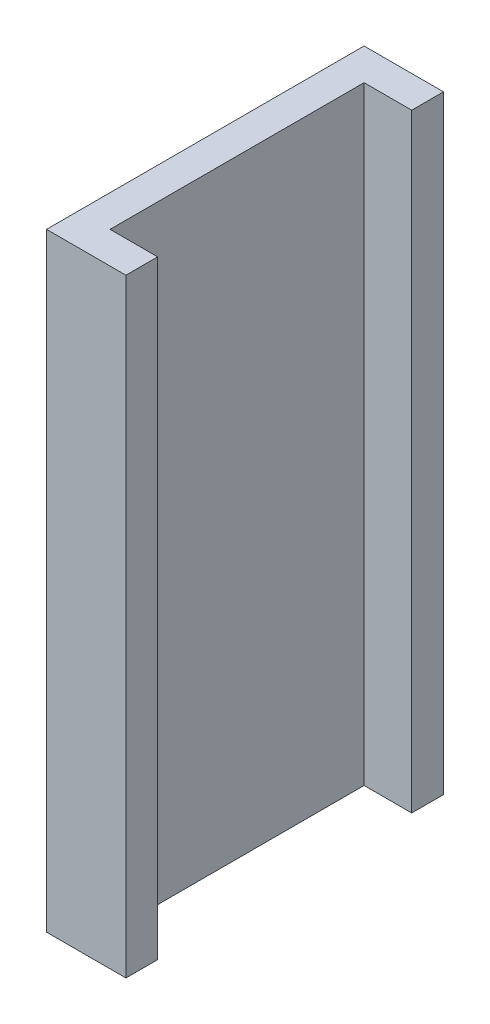
ISO-10303-21;
HEADER;
FILE_DESCRIPTION(('STEP AP214'),'2;1');
FILE_NAME('part.step','',(''),(''),'','','');
FILE_SCHEMA(('AUTOMOTIVE_DESIGN { 1 0 10303 214 1 1 1 1 }'));
ENDSEC;
DATA;
#1=APPLICATION_CONTEXT('core data for automotive mechanical design processes');
#2=APPLICATION_PROTOCOL_DEFINITION('international standard','automotive_design',2000,#1);
#3=PRODUCT_CONTEXT('',#1,'mechanical');
#4=PRODUCT('Part','Part','',(#3));
#5=PRODUCT_RELATED_PRODUCT_CATEGORY('part','',(#4));
#6=PRODUCT_DEFINITION_FORMATION('','',#4);
#7=PRODUCT_DEFINITION_CONTEXT('part definition',#1,'design');
#8=PRODUCT_DEFINITION('design','',#6,#7);
#9=PRODUCT_DEFINITION_SHAPE('','',#8);
#10=(LENGTH_UNIT() NAMED_UNIT(*) SI_UNIT(.MILLI.,.METRE.));
#11=(NAMED_UNIT(*) PLANE_ANGLE_UNIT() SI_UNIT($,.RADIAN.));
#12=(NAMED_UNIT(*) SI_UNIT($,.STERADIAN.) SOLID_ANGLE_UNIT());
#13=UNCERTAINTY_MEASURE_WITH_UNIT(LENGTH_MEASURE(1.E-05),#10,'distance_accuracy_value','');
#14=(GEOMETRIC_REPRESENTATION_CONTEXT(3) GLOBAL_UNCERTAINTY_ASSIGNED_CONTEXT((#13)) GLOBAL_UNIT_ASSIGNED_CONTEXT((#10,
#11,#12)) REPRESENTATION_CONTEXT('',''));
#15=CARTESIAN_POINT('',(0.,0.,0.));
#16=DIRECTION('',(0.,0.,1.));
#17=DIRECTION('',(1.,0.,0.));
#18=AXIS2_PLACEMENT_3D('',#15,#16,#17);
#19=CARTESIAN_POINT('',(0.15,0.,0.));
#20=DIRECTION('',(1.,0.,0.));
#21=DIRECTION('',(0.,0.,-1.));
#22=AXIS2_PLACEMENT_3D('',#19,#20,#21);
#23=PLANE('',#22);
#24=DIRECTION('',(0.,0.,1.));
#25=VECTOR('',#24,1.);
#26=CARTESIAN_POINT('',(0.15,1.15,0.));
#27=LINE('',#26,#25);
#28=CARTESIAN_POINT('',(0.15,1.15,0.06));
#29=VERTEX_POINT('',#28);
#30=CARTESIAN_POINT('',(0.15,1.15,0.));
#31=VERTEX_POINT('',#30);
#32=EDGE_CURVE('E100',#29,#31,#27,.F.);
#33=ORIENTED_EDGE('',*,*,#32,.F.);
#34=DIRECTION('',(0.,1.,0.));
#35=VECTOR('',#34,1.);
#36=CARTESIAN_POINT('',(0.15,0.,0.06));
#37=LINE('',#36,#35);
#38=CARTESIAN_POINT('',(0.15,0.,0.06));
#39=VERTEX_POINT('',#38);
#40=EDGE_CURVE('E99',#39,#29,#37,.T.);
#41=ORIENTED_EDGE('',*,*,#40,.F.);
#42=DIRECTION('',(0.,0.,1.));
#43=VECTOR('',#42,1.);
#44=CARTESIAN_POINT('',(0.15,0.,0.));
#45=LINE('',#44,#43);
#46=CARTESIAN_POINT('',(0.15,0.,0.));
#47=VERTEX_POINT('',#46);
#48=EDGE_CURVE('E84',#39,#47,#45,.F.);
#49=ORIENTED_EDGE('',*,*,#48,.T.);
#50=DIRECTION('',(0.,1.,0.));
#51=VECTOR('',#50,1.);
#52=CARTESIAN_POINT('',(0.15,0.,0.));
#53=LINE('',#52,#51);
#54=EDGE_CURVE('E110',#47,#31,#53,.T.);
#55=ORIENTED_EDGE('',*,*,#54,.T.);
#56=EDGE_LOOP('',(#33,#41,#49,#55));
#57=FACE_BOUND('',#56,.T.);
#58=ADVANCED_FACE('F17',(#57),#23,.T.);
#59=CARTESIAN_POINT('',(0.06,0.,0.54));
#60=DIRECTION('',(0.,0.,1.));
#61=DIRECTION('',(1.,0.,0.));
#62=AXIS2_PLACEMENT_3D('',#59,#60,#61);
#63=PLANE('',#62);
#64=DIRECTION('',(1.,0.,0.));
#65=VECTOR('',#64,1.);
#66=CARTESIAN_POINT('',(0.,0.,0.54));
#67=LINE('',#66,#65);
#68=CARTESIAN_POINT('',(0.15,0.,0.54));
#69=VERTEX_POINT('',#68);
#70=CARTESIAN_POINT('',(0.06,0.,0.54));
#71=VERTEX_POINT('',#70);
#72=EDGE_CURVE('E112',#69,#71,#67,.F.);
#73=ORIENTED_EDGE('',*,*,#72,.T.);
#74=DIRECTION('',(0.,1.,0.));
#75=VECTOR('',#74,1.);
#76=CARTESIAN_POINT('',(0.06,0.,0.54));
#77=LINE('',#76,#75);
#78=CARTESIAN_POINT('',(0.06,1.15,0.54));
#79=VERTEX_POINT('',#78);
#80=EDGE_CURVE('E20',#79,#71,#77,.F.);
#81=ORIENTED_EDGE('',*,*,#80,.F.);
#82=DIRECTION('',(1.,0.,0.));
#83=VECTOR('',#82,1.);
#84=CARTESIAN_POINT('',(0.,1.15,0.54));
#85=LINE('',#84,#83);
#86=CARTESIAN_POINT('',(0.15,1.15,0.54));
#87=VERTEX_POINT('',#86);
#88=EDGE_CURVE('E226',#87,#79,#85,.F.);
#89=ORIENTED_EDGE('',*,*,#88,.F.);
#90=DIRECTION('',(0.,1.,0.));
#91=VECTOR('',#90,1.);
#92=CARTESIAN_POINT('',(0.15,0.,0.54));
#93=LINE('',#92,#91);
#94=EDGE_CURVE('E78',#69,#87,#93,.T.);
#95=ORIENTED_EDGE('',*,*,#94,.F.);
#96=EDGE_LOOP('',(#73,#81,#89,#95));
#97=FACE_BOUND('',#96,.T.);
#98=ADVANCED_FACE('F124',(#97),#63,.F.);
#99=CARTESIAN_POINT('',(0.06,0.,0.06));
#100=DIRECTION('',(1.,0.,0.));
#101=DIRECTION('',(0.,0.,-1.));
#102=AXIS2_PLACEMENT_3D('',#99,#100,#101);
#103=PLANE('',#102);
#104=DIRECTION('',(0.,0.,1.));
#105=VECTOR('',#104,1.);
#106=CARTESIAN_POINT('',(0.06,1.15,0.));
#107=LINE('',#106,#105);
#108=CARTESIAN_POINT('',(0.06,1.15,0.06));
#109=VERTEX_POINT('',#108);
#110=EDGE_CURVE('E123',#79,#109,#107,.F.);
#111=ORIENTED_EDGE('',*,*,#110,.F.);
#112=ORIENTED_EDGE('',*,*,#80,.T.);
#113=DIRECTION('',(0.,0.,1.));
#114=VECTOR('',#113,1.);
#115=CARTESIAN_POINT('',(0.06,0.,0.));
#116=LINE('',#115,#114);
#117=CARTESIAN_POINT('',(0.06,0.,0.06));
#118=VERTEX_POINT('',#117);
#119=EDGE_CURVE('E108',#71,#118,#116,.F.);
#120=ORIENTED_EDGE('',*,*,#119,.T.);
#121=DIRECTION('',(0.,1.,0.));
#122=VECTOR('',#121,1.);
#123=CARTESIAN_POINT('',(0.06,0.,0.06));
#124=LINE('',#123,#122);
#125=EDGE_CURVE('E104',#109,#118,#124,.F.);
#126=ORIENTED_EDGE('',*,*,#125,.F.);
#127=EDGE_LOOP('',(#111,#112,#120,#126));
#128=FACE_BOUND('',#127,.T.);
#129=ADVANCED_FACE('F122',(#128),#103,.T.);
#130=CARTESIAN_POINT('',(0.06,0.,0.06));
#131=DIRECTION('',(0.,0.,1.));
#132=DIRECTION('',(1.,0.,0.));
#133=AXIS2_PLACEMENT_3D('',#130,#131,#132);
#134=PLANE('',#133);
#135=DIRECTION('',(1.,0.,0.));
#136=VECTOR('',#135,1.);
#137=CARTESIAN_POINT('',(0.,0.,0.06));
#138=LINE('',#137,#136);
#139=EDGE_CURVE('E89',#118,#39,#138,.T.);
#140=ORIENTED_EDGE('',*,*,#139,.T.);
#141=ORIENTED_EDGE('',*,*,#40,.T.);
#142=DIRECTION('',(1.,0.,0.));
#143=VECTOR('',#142,1.);
#144=CARTESIAN_POINT('',(0.,1.15,0.06));
#145=LINE('',#144,#143);
#146=EDGE_CURVE('E240',#109,#29,#145,.T.);
#147=ORIENTED_EDGE('',*,*,#146,.F.);
#148=ORIENTED_EDGE('',*,*,#125,.T.);
#149=EDGE_LOOP('',(#140,#141,#147,#148));
#150=FACE_BOUND('',#149,.T.);
#151=ADVANCED_FACE('F106',(#150),#134,.T.);
#152=CARTESIAN_POINT('',(0.15,0.,0.));
#153=DIRECTION('',(1.,0.,0.));
#154=DIRECTION('',(0.,0.,-1.));
#155=AXIS2_PLACEMENT_3D('',#152,#153,#154);
#156=PLANE('',#155);
#157=DIRECTION('',(0.,0.,1.));
#158=VECTOR('',#157,1.);
#159=CARTESIAN_POINT('',(0.15,1.15,0.));
#160=LINE('',#159,#158);
#161=CARTESIAN_POINT('',(0.15,1.15,0.6));
#162=VERTEX_POINT('',#161);
#163=EDGE_CURVE('E224',#162,#87,#160,.F.);
#164=ORIENTED_EDGE('',*,*,#163,.F.);
#165=DIRECTION('',(0.,1.,0.));
#166=VECTOR('',#165,1.);
#167=CARTESIAN_POINT('',(0.15,0.,0.6));
#168=LINE('',#167,#166);
#169=CARTESIAN_POINT('',(0.15,0.,0.6));
#170=VERTEX_POINT('',#169);
#171=EDGE_CURVE('E225',#170,#162,#168,.T.);
#172=ORIENTED_EDGE('',*,*,#171,.F.);
#173=DIRECTION('',(0.,0.,1.));
#174=VECTOR('',#173,1.);
#175=CARTESIAN_POINT('',(0.15,0.,0.));
#176=LINE('',#175,#174);
#177=EDGE_CURVE('E96',#170,#69,#176,.F.);
#178=ORIENTED_EDGE('',*,*,#177,.T.);
#179=ORIENTED_EDGE('',*,*,#94,.T.);
#180=EDGE_LOOP('',(#164,#172,#178,#179));
#181=FACE_BOUND('',#180,.T.);
#182=ADVANCED_FACE('F153',(#181),#156,.T.);
#183=CARTESIAN_POINT('',(0.,0.,0.));
#184=DIRECTION('',(0.,1.,0.));
#185=DIRECTION('',(0.,0.,1.));
#186=AXIS2_PLACEMENT_3D('',#183,#184,#185);
#187=PLANE('',#186);
#188=ORIENTED_EDGE('',*,*,#119,.F.);
#189=ORIENTED_EDGE('',*,*,#72,.F.);
#190=ORIENTED_EDGE('',*,*,#177,.F.);
#191=DIRECTION('',(1.,0.,0.));
#192=VECTOR('',#191,1.);
#193=CARTESIAN_POINT('',(0.,0.,0.6));
#194=LINE('',#193,#192);
#195=CARTESIAN_POINT('',(0.,0.,0.6));
#196=VERTEX_POINT('',#195);
#197=EDGE_CURVE('E234',#196,#170,#194,.T.);
#198=ORIENTED_EDGE('',*,*,#197,.F.);
#199=DIRECTION('',(0.,0.,-1.));
#200=VECTOR('',#199,1.);
#201=CARTESIAN_POINT('',(0.,0.,0.));
#202=LINE('',#201,#200);
#203=CARTESIAN_POINT('',(0.,0.,0.));
#204=VERTEX_POINT('',#203);
#205=EDGE_CURVE('E230',#196,#204,#202,.T.);
#206=ORIENTED_EDGE('',*,*,#205,.T.);
#207=DIRECTION('',(1.,0.,0.));
#208=VECTOR('',#207,1.);
#209=CARTESIAN_POINT('',(0.,0.,0.));
#210=LINE('',#209,#208);
#211=EDGE_CURVE('E92',#204,#47,#210,.T.);
#212=ORIENTED_EDGE('',*,*,#211,.T.);
#213=ORIENTED_EDGE('',*,*,#48,.F.);
#214=ORIENTED_EDGE('',*,*,#139,.F.);
#215=EDGE_LOOP('',(#188,#189,#190,#198,#206,#212,#213,#214));
#216=FACE_BOUND('',#215,.T.);
#217=ADVANCED_FACE('F87',(#216),#187,.F.);
#218=CARTESIAN_POINT('',(0.,0.,0.));
#219=DIRECTION('',(0.,0.,1.));
#220=DIRECTION('',(1.,0.,0.));
#221=AXIS2_PLACEMENT_3D('',#218,#219,#220);
#222=PLANE('',#221);
#223=ORIENTED_EDGE('',*,*,#54,.F.);
#224=ORIENTED_EDGE('',*,*,#211,.F.);
#225=DIRECTION('',(0.,1.,0.));
#226=VECTOR('',#225,1.);
#227=CARTESIAN_POINT('',(0.,0.,0.));
#228=LINE('',#227,#226);
#229=CARTESIAN_POINT('',(0.,1.15,0.));
#230=VERTEX_POINT('',#229);
#231=EDGE_CURVE('E232',#204,#230,#228,.T.);
#232=ORIENTED_EDGE('',*,*,#231,.T.);
#233=DIRECTION('',(1.,0.,0.));
#234=VECTOR('',#233,1.);
#235=CARTESIAN_POINT('',(0.,1.15,0.));
#236=LINE('',#235,#234);
#237=EDGE_CURVE('E227',#31,#230,#236,.F.);
#238=ORIENTED_EDGE('',*,*,#237,.F.);
#239=EDGE_LOOP('',(#223,#224,#232,#238));
#240=FACE_BOUND('',#239,.T.);
#241=ADVANCED_FACE('F146',(#240),#222,.F.);
#242=CARTESIAN_POINT('',(0.,1.15,0.));
#243=DIRECTION('',(0.,1.,0.));
#244=DIRECTION('',(0.,0.,1.));
#245=AXIS2_PLACEMENT_3D('',#242,#243,#244);
#246=PLANE('',#245);
#247=ORIENTED_EDGE('',*,*,#110,.T.);
#248=ORIENTED_EDGE('',*,*,#146,.T.);
#249=ORIENTED_EDGE('',*,*,#32,.T.);
#250=ORIENTED_EDGE('',*,*,#237,.T.);
#251=DIRECTION('',(0.,0.,-1.));
#252=VECTOR('',#251,1.);
#253=CARTESIAN_POINT('',(0.,1.15,0.));
#254=LINE('',#253,#252);
#255=CARTESIAN_POINT('',(0.,1.15,0.6));
#256=VERTEX_POINT('',#255);
#257=EDGE_CURVE('E26',#230,#256,#254,.F.);
#258=ORIENTED_EDGE('',*,*,#257,.T.);
#259=DIRECTION('',(1.,0.,0.));
#260=VECTOR('',#259,1.);
#261=CARTESIAN_POINT('',(0.,1.15,0.6));
#262=LINE('',#261,#260);
#263=EDGE_CURVE('E34',#162,#256,#262,.F.);
#264=ORIENTED_EDGE('',*,*,#263,.F.);
#265=ORIENTED_EDGE('',*,*,#163,.T.);
#266=ORIENTED_EDGE('',*,*,#88,.T.);
#267=EDGE_LOOP('',(#247,#248,#249,#250,#258,#264,#265,#266));
#268=FACE_BOUND('',#267,.T.);
#269=ADVANCED_FACE('F140',(#268),#246,.T.);
#270=CARTESIAN_POINT('',(0.,0.,0.6));
#271=DIRECTION('',(0.,0.,1.));
#272=DIRECTION('',(1.,0.,0.));
#273=AXIS2_PLACEMENT_3D('',#270,#271,#272);
#274=PLANE('',#273);
#275=ORIENTED_EDGE('',*,*,#171,.T.);
#276=ORIENTED_EDGE('',*,*,#263,.T.);
#277=DIRECTION('',(0.,1.,0.));
#278=VECTOR('',#277,1.);
#279=CARTESIAN_POINT('',(0.,0.,0.6));
#280=LINE('',#279,#278);
#281=EDGE_CURVE('E11',#256,#196,#280,.F.);
#282=ORIENTED_EDGE('',*,*,#281,.T.);
#283=ORIENTED_EDGE('',*,*,#197,.T.);
#284=EDGE_LOOP('',(#275,#276,#282,#283));
#285=FACE_BOUND('',#284,.T.);
#286=ADVANCED_FACE('F134',(#285),#274,.T.);
#287=CARTESIAN_POINT('',(0.,0.,0.));
#288=DIRECTION('',(1.,0.,0.));
#289=DIRECTION('',(0.,0.,-1.));
#290=AXIS2_PLACEMENT_3D('',#287,#288,#289);
#291=PLANE('',#290);
#292=ORIENTED_EDGE('',*,*,#257,.F.);
#293=ORIENTED_EDGE('',*,*,#231,.F.);
#294=ORIENTED_EDGE('',*,*,#205,.F.);
#295=ORIENTED_EDGE('',*,*,#281,.F.);
#296=EDGE_LOOP('',(#292,#293,#294,#295));
#297=FACE_BOUND('',#296,.T.);
#298=ADVANCED_FACE('F132',(#297),#291,.F.);
#299=CLOSED_SHELL('',(#58,#98,#129,#151,#182,#217,#241,#269,#286,#298));
#300=MANIFOLD_SOLID_BREP('B1',#299);
#301=ADVANCED_BREP_SHAPE_REPRESENTATION('',(#18,#300),#14);
#302=SHAPE_DEFINITION_REPRESENTATION(#9,#301);
ENDSEC;
END-ISO-10303-21;
